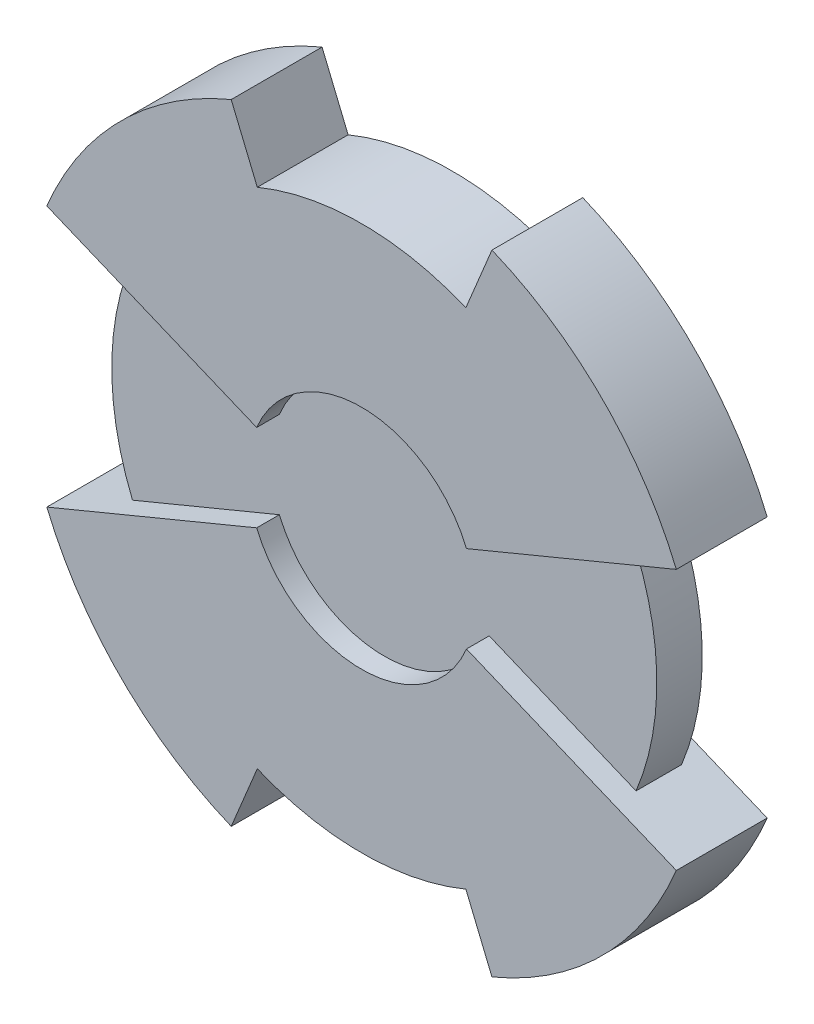
ISO-10303-21;
HEADER;
FILE_DESCRIPTION(('STEP AP214'),'2;1');
FILE_NAME('part.step','',(''),(''),'','','');
FILE_SCHEMA(('AUTOMOTIVE_DESIGN { 1 0 10303 214 1 1 1 1 }'));
ENDSEC;
DATA;
#1=APPLICATION_CONTEXT('core data for automotive mechanical design processes');
#2=APPLICATION_PROTOCOL_DEFINITION('international standard','automotive_design',2000,#1);
#3=PRODUCT_CONTEXT('',#1,'mechanical');
#4=PRODUCT('Part','Part','',(#3));
#5=PRODUCT_RELATED_PRODUCT_CATEGORY('part','',(#4));
#6=PRODUCT_DEFINITION_FORMATION('','',#4);
#7=PRODUCT_DEFINITION_CONTEXT('part definition',#1,'design');
#8=PRODUCT_DEFINITION('design','',#6,#7);
#9=PRODUCT_DEFINITION_SHAPE('','',#8);
#10=(LENGTH_UNIT() NAMED_UNIT(*) SI_UNIT(.MILLI.,.METRE.));
#11=(NAMED_UNIT(*) PLANE_ANGLE_UNIT() SI_UNIT($,.RADIAN.));
#12=(NAMED_UNIT(*) SI_UNIT($,.STERADIAN.) SOLID_ANGLE_UNIT());
#13=UNCERTAINTY_MEASURE_WITH_UNIT(LENGTH_MEASURE(1.E-05),#10,'distance_accuracy_value','');
#14=(GEOMETRIC_REPRESENTATION_CONTEXT(3) GLOBAL_UNCERTAINTY_ASSIGNED_CONTEXT((#13)) GLOBAL_UNIT_ASSIGNED_CONTEXT((#10,
#11,#12)) REPRESENTATION_CONTEXT('',''));
#15=CARTESIAN_POINT('',(0.,0.,0.));
#16=DIRECTION('',(0.,0.,1.));
#17=DIRECTION('',(1.,0.,0.));
#18=AXIS2_PLACEMENT_3D('',#15,#16,#17);
#19=CARTESIAN_POINT('',(0.,0.,10.));
#20=DIRECTION('',(0.,0.,-1.));
#21=DIRECTION('',(-1.,0.,0.));
#22=AXIS2_PLACEMENT_3D('',#19,#20,#21);
#23=CYLINDRICAL_SURFACE('',#22,25.);
#24=DIRECTION('',(0.,0.,-1.));
#25=VECTOR('',#24,1.);
#26=CARTESIAN_POINT('',(23.0969883127822,9.56708580912726,10.));
#27=LINE('',#26,#25);
#28=CARTESIAN_POINT('',(23.0969883127822,9.56708580912726,-5.));
#29=VERTEX_POINT('',#28);
#30=CARTESIAN_POINT('',(23.0969883127822,9.56708580912726,-10.));
#31=VERTEX_POINT('',#30);
#32=EDGE_CURVE('E52',#29,#31,#27,.T.);
#33=ORIENTED_EDGE('',*,*,#32,.F.);
#34=CARTESIAN_POINT('',(0.,0.,-5.));
#35=DIRECTION('',(0.,0.,1.));
#36=DIRECTION('',(1.,0.,0.));
#37=AXIS2_PLACEMENT_3D('',#34,#35,#36);
#38=CIRCLE('',#37,25.);
#39=CARTESIAN_POINT('',(-23.0969883127822,9.56708580912726,-5.));
#40=VERTEX_POINT('',#39);
#41=EDGE_CURVE('E663',#29,#40,#38,.T.);
#42=ORIENTED_EDGE('',*,*,#41,.T.);
#43=DIRECTION('',(0.,0.,-1.));
#44=VECTOR('',#43,1.);
#45=CARTESIAN_POINT('',(-23.0969883127822,9.56708580912726,10.));
#46=LINE('',#45,#44);
#47=CARTESIAN_POINT('',(-23.0969883127822,9.56708580912726,-10.));
#48=VERTEX_POINT('',#47);
#49=EDGE_CURVE('E103',#40,#48,#46,.T.);
#50=ORIENTED_EDGE('',*,*,#49,.T.);
#51=CARTESIAN_POINT('',(0.,0.,-10.));
#52=DIRECTION('',(0.,0.,1.));
#53=DIRECTION('',(1.,0.,0.));
#54=AXIS2_PLACEMENT_3D('',#51,#52,#53);
#55=CIRCLE('',#54,25.);
#56=EDGE_CURVE('E164',#31,#48,#55,.T.);
#57=ORIENTED_EDGE('',*,*,#56,.F.);
#58=EDGE_LOOP('',(#33,#42,#50,#57));
#59=FACE_BOUND('',#58,.T.);
#60=ADVANCED_FACE('F43',(#59),#23,.F.);
#61=CARTESIAN_POINT('',(0.,0.,5.));
#62=DIRECTION('',(0.,0.,1.));
#63=DIRECTION('',(1.,0.,0.));
#64=AXIS2_PLACEMENT_3D('',#61,#62,#63);
#65=CIRCLE('',#64,25.);
#66=CARTESIAN_POINT('',(23.0969883127822,9.56708580912726,5.));
#67=VERTEX_POINT('',#66);
#68=CARTESIAN_POINT('',(-23.0969883127822,9.56708580912726,5.));
#69=VERTEX_POINT('',#68);
#70=EDGE_CURVE('E233',#67,#69,#65,.T.);
#71=ORIENTED_EDGE('',*,*,#70,.F.);
#72=CARTESIAN_POINT('',(23.0969883127822,9.56708580912726,10.));
#73=VERTEX_POINT('',#72);
#74=EDGE_CURVE('E11',#73,#67,#27,.T.);
#75=ORIENTED_EDGE('',*,*,#74,.F.);
#76=CARTESIAN_POINT('',(0.,0.,10.));
#77=DIRECTION('',(0.,0.,1.));
#78=DIRECTION('',(1.,0.,0.));
#79=AXIS2_PLACEMENT_3D('',#76,#77,#78);
#80=CIRCLE('',#79,25.);
#81=CARTESIAN_POINT('',(-23.0969883127822,9.56708580912726,10.));
#82=VERTEX_POINT('',#81);
#83=EDGE_CURVE('E191',#73,#82,#80,.T.);
#84=ORIENTED_EDGE('',*,*,#83,.T.);
#85=EDGE_CURVE('E68',#82,#69,#46,.T.);
#86=ORIENTED_EDGE('',*,*,#85,.T.);
#87=EDGE_LOOP('',(#71,#75,#84,#86));
#88=FACE_BOUND('',#87,.T.);
#89=ADVANCED_FACE('F45',(#88),#23,.F.);
#90=CARTESIAN_POINT('',(0.,0.,10.));
#91=DIRECTION('',(-0.38268343236509,0.923879532511287,0.));
#92=DIRECTION('',(-0.923879532511287,-0.38268343236509,0.));
#93=AXIS2_PLACEMENT_3D('',#90,#91,#92);
#94=PLANE('',#93);
#95=ORIENTED_EDGE('',*,*,#74,.T.);
#96=DIRECTION('',(0.923879532511287,0.38268343236509,0.));
#97=VECTOR('',#96,1.);
#98=CARTESIAN_POINT('',(0.,0.,5.));
#99=LINE('',#98,#97);
#100=CARTESIAN_POINT('',(55.4327719506772,22.9610059419054,5.));
#101=VERTEX_POINT('',#100);
#102=EDGE_CURVE('E242',#67,#101,#99,.T.);
#103=ORIENTED_EDGE('',*,*,#102,.T.);
#104=DIRECTION('',(0.,0.,-1.));
#105=VECTOR('',#104,1.);
#106=CARTESIAN_POINT('',(55.4327719506772,22.9610059419054,5.));
#107=LINE('',#106,#105);
#108=CARTESIAN_POINT('',(55.4327719506772,22.9610059419054,-5.));
#109=VERTEX_POINT('',#108);
#110=EDGE_CURVE('E676',#101,#109,#107,.T.);
#111=ORIENTED_EDGE('',*,*,#110,.T.);
#112=DIRECTION('',(0.923879532511287,0.38268343236509,0.));
#113=VECTOR('',#112,1.);
#114=CARTESIAN_POINT('',(0.,0.,-5.));
#115=LINE('',#114,#113);
#116=EDGE_CURVE('E219',#29,#109,#115,.T.);
#117=ORIENTED_EDGE('',*,*,#116,.F.);
#118=ORIENTED_EDGE('',*,*,#32,.T.);
#119=DIRECTION('',(0.923879532511287,0.38268343236509,0.));
#120=VECTOR('',#119,1.);
#121=CARTESIAN_POINT('',(0.,0.,-10.));
#122=LINE('',#121,#120);
#123=CARTESIAN_POINT('',(69.2909649383465,28.7012574273818,-10.));
#124=VERTEX_POINT('',#123);
#125=EDGE_CURVE('E167',#31,#124,#122,.T.);
#126=ORIENTED_EDGE('',*,*,#125,.T.);
#127=DIRECTION('',(0.,0.,-1.));
#128=VECTOR('',#127,1.);
#129=CARTESIAN_POINT('',(69.2909649383465,28.7012574273818,10.));
#130=LINE('',#129,#128);
#131=CARTESIAN_POINT('',(69.2909649383465,28.7012574273818,10.));
#132=VERTEX_POINT('',#131);
#133=EDGE_CURVE('E203',#132,#124,#130,.T.);
#134=ORIENTED_EDGE('',*,*,#133,.F.);
#135=DIRECTION('',(0.923879532511287,0.38268343236509,0.));
#136=VECTOR('',#135,1.);
#137=CARTESIAN_POINT('',(0.,0.,10.));
#138=LINE('',#137,#136);
#139=EDGE_CURVE('E245',#73,#132,#138,.T.);
#140=ORIENTED_EDGE('',*,*,#139,.F.);
#141=EDGE_LOOP('',(#95,#103,#111,#117,#118,#126,#134,#140));
#142=FACE_BOUND('',#141,.T.);
#143=ADVANCED_FACE('F215',(#142),#94,.F.);
#144=CARTESIAN_POINT('',(0.,0.,10.));
#145=DIRECTION('',(0.,0.,-1.));
#146=DIRECTION('',(-1.,0.,0.));
#147=AXIS2_PLACEMENT_3D('',#144,#145,#146);
#148=CYLINDRICAL_SURFACE('',#147,75.);
#149=CARTESIAN_POINT('',(0.,0.,-10.));
#150=DIRECTION('',(0.,0.,1.));
#151=DIRECTION('',(1.,0.,0.));
#152=AXIS2_PLACEMENT_3D('',#149,#150,#151);
#153=CIRCLE('',#152,75.);
#154=CARTESIAN_POINT('',(28.7012574273813,69.2909649383467,-10.));
#155=VERTEX_POINT('',#154);
#156=EDGE_CURVE('E171',#124,#155,#153,.T.);
#157=ORIENTED_EDGE('',*,*,#156,.T.);
#158=DIRECTION('',(0.,0.,-1.));
#159=VECTOR('',#158,1.);
#160=CARTESIAN_POINT('',(28.7012574273813,69.2909649383467,10.));
#161=LINE('',#160,#159);
#162=CARTESIAN_POINT('',(28.7012574273813,69.2909649383467,10.));
#163=VERTEX_POINT('',#162);
#164=EDGE_CURVE('E201',#163,#155,#161,.T.);
#165=ORIENTED_EDGE('',*,*,#164,.F.);
#166=CARTESIAN_POINT('',(0.,0.,10.));
#167=DIRECTION('',(0.,0.,1.));
#168=DIRECTION('',(1.,0.,0.));
#169=AXIS2_PLACEMENT_3D('',#166,#167,#168);
#170=CIRCLE('',#169,75.);
#171=EDGE_CURVE('E247',#132,#163,#170,.T.);
#172=ORIENTED_EDGE('',*,*,#171,.F.);
#173=ORIENTED_EDGE('',*,*,#133,.T.);
#174=EDGE_LOOP('',(#157,#165,#172,#173));
#175=FACE_BOUND('',#174,.T.);
#176=ADVANCED_FACE('F230',(#175),#148,.T.);
#177=CARTESIAN_POINT('',(0.,0.,10.));
#178=DIRECTION('',(-0.923879532511289,0.382683432365084,0.));
#179=DIRECTION('',(-0.382683432365084,-0.923879532511289,0.));
#180=AXIS2_PLACEMENT_3D('',#177,#178,#179);
#181=PLANE('',#180);
#182=DIRECTION('',(0.382683432365084,0.923879532511289,0.));
#183=VECTOR('',#182,1.);
#184=CARTESIAN_POINT('',(0.,0.,-10.));
#185=LINE('',#184,#183);
#186=CARTESIAN_POINT('',(22.9610059419051,55.4327719506773,-10.));
#187=VERTEX_POINT('',#186);
#188=EDGE_CURVE('E175',#187,#155,#185,.T.);
#189=ORIENTED_EDGE('',*,*,#188,.F.);
#190=DIRECTION('',(0.,0.,-1.));
#191=VECTOR('',#190,1.);
#192=CARTESIAN_POINT('',(22.9610059419051,55.4327719506773,10.));
#193=LINE('',#192,#191);
#194=CARTESIAN_POINT('',(22.9610059419051,55.4327719506773,10.));
#195=VERTEX_POINT('',#194);
#196=EDGE_CURVE('E198',#195,#187,#193,.T.);
#197=ORIENTED_EDGE('',*,*,#196,.F.);
#198=DIRECTION('',(0.382683432365084,0.923879532511289,0.));
#199=VECTOR('',#198,1.);
#200=CARTESIAN_POINT('',(0.,0.,10.));
#201=LINE('',#200,#199);
#202=EDGE_CURVE('E256',#195,#163,#201,.T.);
#203=ORIENTED_EDGE('',*,*,#202,.T.);
#204=ORIENTED_EDGE('',*,*,#164,.T.);
#205=EDGE_LOOP('',(#189,#197,#203,#204));
#206=FACE_BOUND('',#205,.T.);
#207=ADVANCED_FACE('F262',(#206),#181,.T.);
#208=CARTESIAN_POINT('',(0.,0.,10.));
#209=DIRECTION('',(0.,0.,-1.));
#210=DIRECTION('',(-1.,0.,0.));
#211=AXIS2_PLACEMENT_3D('',#208,#209,#210);
#212=CYLINDRICAL_SURFACE('',#211,60.);
#213=CARTESIAN_POINT('',(0.,0.,-10.));
#214=DIRECTION('',(0.,0.,1.));
#215=DIRECTION('',(1.,0.,0.));
#216=AXIS2_PLACEMENT_3D('',#213,#214,#215);
#217=CIRCLE('',#216,60.);
#218=CARTESIAN_POINT('',(-22.9610059419051,55.4327719506773,-10.));
#219=VERTEX_POINT('',#218);
#220=EDGE_CURVE('E179',#187,#219,#217,.T.);
#221=ORIENTED_EDGE('',*,*,#220,.T.);
#222=DIRECTION('',(0.,0.,-1.));
#223=VECTOR('',#222,1.);
#224=CARTESIAN_POINT('',(-22.9610059419051,55.4327719506773,10.));
#225=LINE('',#224,#223);
#226=CARTESIAN_POINT('',(-22.9610059419051,55.4327719506773,10.));
#227=VERTEX_POINT('',#226);
#228=EDGE_CURVE('E153',#227,#219,#225,.T.);
#229=ORIENTED_EDGE('',*,*,#228,.F.);
#230=CARTESIAN_POINT('',(0.,0.,10.));
#231=DIRECTION('',(0.,0.,1.));
#232=DIRECTION('',(1.,0.,0.));
#233=AXIS2_PLACEMENT_3D('',#230,#231,#232);
#234=CIRCLE('',#233,60.);
#235=EDGE_CURVE('E138',#195,#227,#234,.T.);
#236=ORIENTED_EDGE('',*,*,#235,.F.);
#237=ORIENTED_EDGE('',*,*,#196,.T.);
#238=EDGE_LOOP('',(#221,#229,#236,#237));
#239=FACE_BOUND('',#238,.T.);
#240=ADVANCED_FACE('F266',(#239),#212,.T.);
#241=CARTESIAN_POINT('',(0.,0.,10.));
#242=DIRECTION('',(-0.923879532511289,-0.382683432365084,0.));
#243=DIRECTION('',(0.382683432365084,-0.923879532511289,0.));
#244=AXIS2_PLACEMENT_3D('',#241,#242,#243);
#245=PLANE('',#244);
#246=DIRECTION('',(-0.382683432365084,0.923879532511289,0.));
#247=VECTOR('',#246,1.);
#248=CARTESIAN_POINT('',(0.,0.,-10.));
#249=LINE('',#248,#247);
#250=CARTESIAN_POINT('',(-28.7012574273813,69.2909649383467,-10.));
#251=VERTEX_POINT('',#250);
#252=EDGE_CURVE('E148',#219,#251,#249,.T.);
#253=ORIENTED_EDGE('',*,*,#252,.T.);
#254=DIRECTION('',(0.,0.,-1.));
#255=VECTOR('',#254,1.);
#256=CARTESIAN_POINT('',(-28.7012574273813,69.2909649383467,10.));
#257=LINE('',#256,#255);
#258=CARTESIAN_POINT('',(-28.7012574273813,69.2909649383467,10.));
#259=VERTEX_POINT('',#258);
#260=EDGE_CURVE('E145',#259,#251,#257,.T.);
#261=ORIENTED_EDGE('',*,*,#260,.F.);
#262=DIRECTION('',(-0.382683432365084,0.923879532511289,0.));
#263=VECTOR('',#262,1.);
#264=CARTESIAN_POINT('',(0.,0.,10.));
#265=LINE('',#264,#263);
#266=EDGE_CURVE('E128',#227,#259,#265,.T.);
#267=ORIENTED_EDGE('',*,*,#266,.F.);
#268=ORIENTED_EDGE('',*,*,#228,.T.);
#269=EDGE_LOOP('',(#253,#261,#267,#268));
#270=FACE_BOUND('',#269,.T.);
#271=ADVANCED_FACE('F146',(#270),#245,.F.);
#272=CARTESIAN_POINT('',(0.,0.,10.));
#273=DIRECTION('',(0.,0.,-1.));
#274=DIRECTION('',(-1.,0.,0.));
#275=AXIS2_PLACEMENT_3D('',#272,#273,#274);
#276=CYLINDRICAL_SURFACE('',#275,75.);
#277=CARTESIAN_POINT('',(0.,0.,-10.));
#278=DIRECTION('',(0.,0.,1.));
#279=DIRECTION('',(1.,0.,0.));
#280=AXIS2_PLACEMENT_3D('',#277,#278,#279);
#281=CIRCLE('',#280,75.);
#282=CARTESIAN_POINT('',(-69.2909649383465,28.7012574273818,-10.));
#283=VERTEX_POINT('',#282);
#284=EDGE_CURVE('E184',#251,#283,#281,.T.);
#285=ORIENTED_EDGE('',*,*,#284,.T.);
#286=DIRECTION('',(0.,0.,-1.));
#287=VECTOR('',#286,1.);
#288=CARTESIAN_POINT('',(-69.2909649383465,28.7012574273818,10.));
#289=LINE('',#288,#287);
#290=CARTESIAN_POINT('',(-69.2909649383465,28.7012574273818,10.));
#291=VERTEX_POINT('',#290);
#292=EDGE_CURVE('E154',#291,#283,#289,.T.);
#293=ORIENTED_EDGE('',*,*,#292,.F.);
#294=CARTESIAN_POINT('',(0.,0.,10.));
#295=DIRECTION('',(0.,0.,1.));
#296=DIRECTION('',(1.,0.,0.));
#297=AXIS2_PLACEMENT_3D('',#294,#295,#296);
#298=CIRCLE('',#297,75.);
#299=EDGE_CURVE('E134',#259,#291,#298,.T.);
#300=ORIENTED_EDGE('',*,*,#299,.F.);
#301=ORIENTED_EDGE('',*,*,#260,.T.);
#302=EDGE_LOOP('',(#285,#293,#300,#301));
#303=FACE_BOUND('',#302,.T.);
#304=ADVANCED_FACE('F156',(#303),#276,.T.);
#305=CARTESIAN_POINT('',(0.,0.,10.));
#306=DIRECTION('',(-0.38268343236509,-0.923879532511287,0.));
#307=DIRECTION('',(0.923879532511287,-0.38268343236509,0.));
#308=AXIS2_PLACEMENT_3D('',#305,#306,#307);
#309=PLANE('',#308);
#310=DIRECTION('',(-0.923879532511287,0.38268343236509,0.));
#311=VECTOR('',#310,1.);
#312=CARTESIAN_POINT('',(0.,0.,5.));
#313=LINE('',#312,#311);
#314=CARTESIAN_POINT('',(-55.4327719506772,22.9610059419054,5.));
#315=VERTEX_POINT('',#314);
#316=EDGE_CURVE('E241',#69,#315,#313,.T.);
#317=ORIENTED_EDGE('',*,*,#316,.F.);
#318=ORIENTED_EDGE('',*,*,#85,.F.);
#319=DIRECTION('',(-0.923879532511287,0.38268343236509,0.));
#320=VECTOR('',#319,1.);
#321=CARTESIAN_POINT('',(0.,0.,10.));
#322=LINE('',#321,#320);
#323=EDGE_CURVE('E158',#82,#291,#322,.T.);
#324=ORIENTED_EDGE('',*,*,#323,.T.);
#325=ORIENTED_EDGE('',*,*,#292,.T.);
#326=DIRECTION('',(-0.923879532511287,0.38268343236509,0.));
#327=VECTOR('',#326,1.);
#328=CARTESIAN_POINT('',(0.,0.,-10.));
#329=LINE('',#328,#327);
#330=EDGE_CURVE('E187',#48,#283,#329,.T.);
#331=ORIENTED_EDGE('',*,*,#330,.F.);
#332=ORIENTED_EDGE('',*,*,#49,.F.);
#333=DIRECTION('',(-0.923879532511287,0.38268343236509,0.));
#334=VECTOR('',#333,1.);
#335=CARTESIAN_POINT('',(0.,0.,-5.));
#336=LINE('',#335,#334);
#337=CARTESIAN_POINT('',(-55.4327719506772,22.9610059419054,-5.));
#338=VERTEX_POINT('',#337);
#339=EDGE_CURVE('E666',#40,#338,#336,.T.);
#340=ORIENTED_EDGE('',*,*,#339,.T.);
#341=DIRECTION('',(0.,0.,-1.));
#342=VECTOR('',#341,1.);
#343=CARTESIAN_POINT('',(-55.4327719506772,22.9610059419054,5.));
#344=LINE('',#343,#342);
#345=EDGE_CURVE('E674',#315,#338,#344,.T.);
#346=ORIENTED_EDGE('',*,*,#345,.F.);
#347=EDGE_LOOP('',(#317,#318,#324,#325,#331,#332,#340,#346));
#348=FACE_BOUND('',#347,.T.);
#349=ADVANCED_FACE('F308',(#348),#309,.T.);
#350=CARTESIAN_POINT('',(0.,0.,10.));
#351=DIRECTION('',(0.,0.,1.));
#352=DIRECTION('',(1.,0.,0.));
#353=AXIS2_PLACEMENT_3D('',#350,#351,#352);
#354=PLANE('',#353);
#355=ORIENTED_EDGE('',*,*,#83,.F.);
#356=ORIENTED_EDGE('',*,*,#139,.T.);
#357=ORIENTED_EDGE('',*,*,#171,.T.);
#358=ORIENTED_EDGE('',*,*,#202,.F.);
#359=ORIENTED_EDGE('',*,*,#235,.T.);
#360=ORIENTED_EDGE('',*,*,#266,.T.);
#361=ORIENTED_EDGE('',*,*,#299,.T.);
#362=ORIENTED_EDGE('',*,*,#323,.F.);
#363=EDGE_LOOP('',(#355,#356,#357,#358,#359,#360,#361,#362));
#364=FACE_BOUND('',#363,.T.);
#365=ADVANCED_FACE('F131',(#364),#354,.T.);
#366=CARTESIAN_POINT('',(0.,0.,-10.));
#367=DIRECTION('',(0.,0.,1.));
#368=DIRECTION('',(1.,0.,0.));
#369=AXIS2_PLACEMENT_3D('',#366,#367,#368);
#370=PLANE('',#369);
#371=ORIENTED_EDGE('',*,*,#56,.T.);
#372=ORIENTED_EDGE('',*,*,#330,.T.);
#373=ORIENTED_EDGE('',*,*,#284,.F.);
#374=ORIENTED_EDGE('',*,*,#252,.F.);
#375=ORIENTED_EDGE('',*,*,#220,.F.);
#376=ORIENTED_EDGE('',*,*,#188,.T.);
#377=ORIENTED_EDGE('',*,*,#156,.F.);
#378=ORIENTED_EDGE('',*,*,#125,.F.);
#379=EDGE_LOOP('',(#371,#372,#373,#374,#375,#376,#377,#378));
#380=FACE_BOUND('',#379,.T.);
#381=ADVANCED_FACE('F221',(#380),#370,.F.);
#382=CARTESIAN_POINT('',(0.,0.,5.));
#383=DIRECTION('',(0.,0.,-1.));
#384=DIRECTION('',(-1.,0.,0.));
#385=AXIS2_PLACEMENT_3D('',#382,#383,#384);
#386=CYLINDRICAL_SURFACE('',#385,60.);
#387=CARTESIAN_POINT('',(0.,0.,-5.));
#388=DIRECTION('',(0.,0.,1.));
#389=DIRECTION('',(1.,0.,0.));
#390=AXIS2_PLACEMENT_3D('',#387,#388,#389);
#391=CIRCLE('',#390,60.);
#392=CARTESIAN_POINT('',(55.4327719506772,-22.9610059419054,-5.));
#393=VERTEX_POINT('',#392);
#394=EDGE_CURVE('E657',#393,#109,#391,.T.);
#395=ORIENTED_EDGE('',*,*,#394,.T.);
#396=ORIENTED_EDGE('',*,*,#110,.F.);
#397=CARTESIAN_POINT('',(0.,0.,5.));
#398=DIRECTION('',(0.,0.,1.));
#399=DIRECTION('',(1.,0.,0.));
#400=AXIS2_PLACEMENT_3D('',#397,#398,#399);
#401=CIRCLE('',#400,60.);
#402=CARTESIAN_POINT('',(55.4327719506772,-22.9610059419054,5.));
#403=VERTEX_POINT('',#402);
#404=EDGE_CURVE('E638',#403,#101,#401,.T.);
#405=ORIENTED_EDGE('',*,*,#404,.F.);
#406=DIRECTION('',(0.,0.,-1.));
#407=VECTOR('',#406,1.);
#408=CARTESIAN_POINT('',(55.4327719506772,-22.9610059419054,5.));
#409=LINE('',#408,#407);
#410=EDGE_CURVE('E168',#403,#393,#409,.T.);
#411=ORIENTED_EDGE('',*,*,#410,.T.);
#412=EDGE_LOOP('',(#395,#396,#405,#411));
#413=FACE_BOUND('',#412,.T.);
#414=ADVANCED_FACE('F328',(#413),#386,.T.);
#415=CARTESIAN_POINT('',(-55.4327719506772,-22.9610059419054,-5.));
#416=VERTEX_POINT('',#415);
#417=EDGE_CURVE('E59',#338,#416,#391,.T.);
#418=ORIENTED_EDGE('',*,*,#417,.T.);
#419=DIRECTION('',(0.,0.,-1.));
#420=VECTOR('',#419,1.);
#421=CARTESIAN_POINT('',(-55.4327719506772,-22.9610059419054,5.));
#422=LINE('',#421,#420);
#423=CARTESIAN_POINT('',(-55.4327719506772,-22.9610059419054,5.));
#424=VERTEX_POINT('',#423);
#425=EDGE_CURVE('E670',#424,#416,#422,.T.);
#426=ORIENTED_EDGE('',*,*,#425,.F.);
#427=EDGE_CURVE('E642',#315,#424,#401,.T.);
#428=ORIENTED_EDGE('',*,*,#427,.F.);
#429=ORIENTED_EDGE('',*,*,#345,.T.);
#430=EDGE_LOOP('',(#418,#426,#428,#429));
#431=FACE_BOUND('',#430,.T.);
#432=ADVANCED_FACE('F363',(#431),#386,.T.);
#433=CARTESIAN_POINT('',(0.,0.,5.));
#434=DIRECTION('',(0.,0.,1.));
#435=DIRECTION('',(1.,0.,0.));
#436=AXIS2_PLACEMENT_3D('',#433,#434,#435);
#437=PLANE('',#436);
#438=DIRECTION('',(-0.923879532511286,-0.382683432365091,0.));
#439=VECTOR('',#438,1.);
#440=CARTESIAN_POINT('',(0.,0.,5.));
#441=LINE('',#440,#439);
#442=CARTESIAN_POINT('',(-23.0969883127822,-9.56708580912727,5.));
#443=VERTEX_POINT('',#442);
#444=EDGE_CURVE('E626',#443,#424,#441,.T.);
#445=ORIENTED_EDGE('',*,*,#444,.F.);
#446=CARTESIAN_POINT('',(0.,0.,5.));
#447=DIRECTION('',(0.,0.,1.));
#448=DIRECTION('',(1.,0.,0.));
#449=AXIS2_PLACEMENT_3D('',#446,#447,#448);
#450=CIRCLE('',#449,25.);
#451=CARTESIAN_POINT('',(23.0969883127822,-9.56708580912727,5.));
#452=VERTEX_POINT('',#451);
#453=EDGE_CURVE('E630',#443,#452,#450,.T.);
#454=ORIENTED_EDGE('',*,*,#453,.T.);
#455=DIRECTION('',(0.923879532511286,-0.382683432365091,0.));
#456=VECTOR('',#455,1.);
#457=CARTESIAN_POINT('',(0.,0.,5.));
#458=LINE('',#457,#456);
#459=EDGE_CURVE('E634',#452,#403,#458,.T.);
#460=ORIENTED_EDGE('',*,*,#459,.T.);
#461=ORIENTED_EDGE('',*,*,#404,.T.);
#462=ORIENTED_EDGE('',*,*,#102,.F.);
#463=ORIENTED_EDGE('',*,*,#70,.T.);
#464=ORIENTED_EDGE('',*,*,#316,.T.);
#465=ORIENTED_EDGE('',*,*,#427,.T.);
#466=EDGE_LOOP('',(#445,#454,#460,#461,#462,#463,#464,#465));
#467=FACE_BOUND('',#466,.T.);
#468=ADVANCED_FACE('F375',(#467),#437,.T.);
#469=CARTESIAN_POINT('',(0.,0.,-5.));
#470=DIRECTION('',(0.,0.,1.));
#471=DIRECTION('',(1.,0.,0.));
#472=AXIS2_PLACEMENT_3D('',#469,#470,#471);
#473=PLANE('',#472);
#474=DIRECTION('',(-0.923879532511286,-0.382683432365091,0.));
#475=VECTOR('',#474,1.);
#476=CARTESIAN_POINT('',(0.,0.,-5.));
#477=LINE('',#476,#475);
#478=CARTESIAN_POINT('',(-23.0969883127822,-9.56708580912727,-5.));
#479=VERTEX_POINT('',#478);
#480=EDGE_CURVE('E625',#479,#416,#477,.T.);
#481=ORIENTED_EDGE('',*,*,#480,.T.);
#482=ORIENTED_EDGE('',*,*,#417,.F.);
#483=ORIENTED_EDGE('',*,*,#339,.F.);
#484=ORIENTED_EDGE('',*,*,#41,.F.);
#485=ORIENTED_EDGE('',*,*,#116,.T.);
#486=ORIENTED_EDGE('',*,*,#394,.F.);
#487=DIRECTION('',(0.923879532511286,-0.382683432365091,0.));
#488=VECTOR('',#487,1.);
#489=CARTESIAN_POINT('',(0.,0.,-5.));
#490=LINE('',#489,#488);
#491=CARTESIAN_POINT('',(23.0969883127822,-9.56708580912727,-5.));
#492=VERTEX_POINT('',#491);
#493=EDGE_CURVE('E653',#492,#393,#490,.T.);
#494=ORIENTED_EDGE('',*,*,#493,.F.);
#495=CARTESIAN_POINT('',(0.,0.,-5.));
#496=DIRECTION('',(0.,0.,1.));
#497=DIRECTION('',(1.,0.,0.));
#498=AXIS2_PLACEMENT_3D('',#495,#496,#497);
#499=CIRCLE('',#498,25.);
#500=EDGE_CURVE('E649',#479,#492,#499,.T.);
#501=ORIENTED_EDGE('',*,*,#500,.F.);
#502=EDGE_LOOP('',(#481,#482,#483,#484,#485,#486,#494,#501));
#503=FACE_BOUND('',#502,.T.);
#504=ADVANCED_FACE('F385',(#503),#473,.F.);
#505=CARTESIAN_POINT('',(0.,0.,10.));
#506=DIRECTION('',(0.,0.,-1.));
#507=DIRECTION('',(-1.,0.,0.));
#508=AXIS2_PLACEMENT_3D('',#505,#506,#507);
#509=CYLINDRICAL_SURFACE('',#508,25.);
#510=ORIENTED_EDGE('',*,*,#500,.T.);
#511=DIRECTION('',(0.,0.,-1.));
#512=VECTOR('',#511,1.);
#513=CARTESIAN_POINT('',(23.0969883127822,-9.56708580912727,10.));
#514=LINE('',#513,#512);
#515=CARTESIAN_POINT('',(23.0969883127822,-9.56708580912727,-10.));
#516=VERTEX_POINT('',#515);
#517=EDGE_CURVE('E604',#492,#516,#514,.T.);
#518=ORIENTED_EDGE('',*,*,#517,.T.);
#519=CARTESIAN_POINT('',(0.,0.,-10.));
#520=DIRECTION('',(0.,0.,1.));
#521=DIRECTION('',(1.,0.,0.));
#522=AXIS2_PLACEMENT_3D('',#519,#520,#521);
#523=CIRCLE('',#522,25.);
#524=CARTESIAN_POINT('',(-23.0969883127822,-9.56708580912727,-10.));
#525=VERTEX_POINT('',#524);
#526=EDGE_CURVE('E581',#525,#516,#523,.T.);
#527=ORIENTED_EDGE('',*,*,#526,.F.);
#528=DIRECTION('',(0.,0.,-1.));
#529=VECTOR('',#528,1.);
#530=CARTESIAN_POINT('',(-23.0969883127822,-9.56708580912727,10.));
#531=LINE('',#530,#529);
#532=EDGE_CURVE('E599',#479,#525,#531,.T.);
#533=ORIENTED_EDGE('',*,*,#532,.F.);
#534=EDGE_LOOP('',(#510,#518,#527,#533));
#535=FACE_BOUND('',#534,.T.);
#536=ADVANCED_FACE('F395',(#535),#509,.F.);
#537=CARTESIAN_POINT('',(0.,0.,10.));
#538=DIRECTION('',(0.923879532511289,-0.382683432365084,0.));
#539=DIRECTION('',(0.382683432365084,0.923879532511289,0.));
#540=AXIS2_PLACEMENT_3D('',#537,#538,#539);
#541=PLANE('',#540);
#542=DIRECTION('',(-0.382683432365084,-0.923879532511289,0.));
#543=VECTOR('',#542,1.);
#544=CARTESIAN_POINT('',(0.,0.,-10.));
#545=LINE('',#544,#543);
#546=CARTESIAN_POINT('',(-22.9610059419051,-55.4327719506773,-10.));
#547=VERTEX_POINT('',#546);
#548=CARTESIAN_POINT('',(-28.7012574273813,-69.2909649383467,-10.));
#549=VERTEX_POINT('',#548);
#550=EDGE_CURVE('E548',#547,#549,#545,.T.);
#551=ORIENTED_EDGE('',*,*,#550,.F.);
#552=DIRECTION('',(0.,0.,-1.));
#553=VECTOR('',#552,1.);
#554=CARTESIAN_POINT('',(-22.9610059419051,-55.4327719506773,10.));
#555=LINE('',#554,#553);
#556=CARTESIAN_POINT('',(-22.9610059419051,-55.4327719506773,10.));
#557=VERTEX_POINT('',#556);
#558=EDGE_CURVE('E621',#557,#547,#555,.T.);
#559=ORIENTED_EDGE('',*,*,#558,.F.);
#560=DIRECTION('',(-0.382683432365084,-0.923879532511289,0.));
#561=VECTOR('',#560,1.);
#562=CARTESIAN_POINT('',(0.,0.,10.));
#563=LINE('',#562,#561);
#564=CARTESIAN_POINT('',(-28.7012574273813,-69.2909649383467,10.));
#565=VERTEX_POINT('',#564);
#566=EDGE_CURVE('E591',#557,#565,#563,.T.);
#567=ORIENTED_EDGE('',*,*,#566,.T.);
#568=DIRECTION('',(0.,0.,-1.));
#569=VECTOR('',#568,1.);
#570=CARTESIAN_POINT('',(-28.7012574273813,-69.2909649383467,10.));
#571=LINE('',#570,#569);
#572=EDGE_CURVE('E592',#565,#549,#571,.T.);
#573=ORIENTED_EDGE('',*,*,#572,.T.);
#574=EDGE_LOOP('',(#551,#559,#567,#573));
#575=FACE_BOUND('',#574,.T.);
#576=ADVANCED_FACE('F405',(#575),#541,.T.);
#577=CARTESIAN_POINT('',(0.,0.,10.));
#578=DIRECTION('',(0.,0.,-1.));
#579=DIRECTION('',(-1.,0.,0.));
#580=AXIS2_PLACEMENT_3D('',#577,#578,#579);
#581=CYLINDRICAL_SURFACE('',#580,60.);
#582=CARTESIAN_POINT('',(0.,0.,-10.));
#583=DIRECTION('',(0.,0.,1.));
#584=DIRECTION('',(1.,0.,0.));
#585=AXIS2_PLACEMENT_3D('',#582,#583,#584);
#586=CIRCLE('',#585,60.);
#587=CARTESIAN_POINT('',(22.9610059419051,-55.4327719506773,-10.));
#588=VERTEX_POINT('',#587);
#589=EDGE_CURVE('E556',#547,#588,#586,.T.);
#590=ORIENTED_EDGE('',*,*,#589,.T.);
#591=DIRECTION('',(0.,0.,-1.));
#592=VECTOR('',#591,1.);
#593=CARTESIAN_POINT('',(22.9610059419051,-55.4327719506773,10.));
#594=LINE('',#593,#592);
#595=CARTESIAN_POINT('',(22.9610059419051,-55.4327719506773,10.));
#596=VERTEX_POINT('',#595);
#597=EDGE_CURVE('E617',#596,#588,#594,.T.);
#598=ORIENTED_EDGE('',*,*,#597,.F.);
#599=CARTESIAN_POINT('',(0.,0.,10.));
#600=DIRECTION('',(0.,0.,1.));
#601=DIRECTION('',(1.,0.,0.));
#602=AXIS2_PLACEMENT_3D('',#599,#600,#601);
#603=CIRCLE('',#602,60.);
#604=EDGE_CURVE('E735',#557,#596,#603,.T.);
#605=ORIENTED_EDGE('',*,*,#604,.F.);
#606=ORIENTED_EDGE('',*,*,#558,.T.);
#607=EDGE_LOOP('',(#590,#598,#605,#606));
#608=FACE_BOUND('',#607,.T.);
#609=ADVANCED_FACE('F417',(#608),#581,.T.);
#610=CARTESIAN_POINT('',(0.,0.,10.));
#611=DIRECTION('',(0.923879532511289,0.382683432365084,0.));
#612=DIRECTION('',(-0.382683432365084,0.923879532511289,0.));
#613=AXIS2_PLACEMENT_3D('',#610,#611,#612);
#614=PLANE('',#613);
#615=DIRECTION('',(0.382683432365084,-0.923879532511289,0.));
#616=VECTOR('',#615,1.);
#617=CARTESIAN_POINT('',(0.,0.,-10.));
#618=LINE('',#617,#616);
#619=CARTESIAN_POINT('',(28.7012574273813,-69.2909649383467,-10.));
#620=VERTEX_POINT('',#619);
#621=EDGE_CURVE('E564',#588,#620,#618,.T.);
#622=ORIENTED_EDGE('',*,*,#621,.T.);
#623=DIRECTION('',(0.,0.,-1.));
#624=VECTOR('',#623,1.);
#625=CARTESIAN_POINT('',(28.7012574273813,-69.2909649383467,10.));
#626=LINE('',#625,#624);
#627=CARTESIAN_POINT('',(28.7012574273813,-69.2909649383467,10.));
#628=VERTEX_POINT('',#627);
#629=EDGE_CURVE('E613',#628,#620,#626,.T.);
#630=ORIENTED_EDGE('',*,*,#629,.F.);
#631=DIRECTION('',(0.382683432365084,-0.923879532511289,0.));
#632=VECTOR('',#631,1.);
#633=CARTESIAN_POINT('',(0.,0.,10.));
#634=LINE('',#633,#632);
#635=EDGE_CURVE('E731',#596,#628,#634,.T.);
#636=ORIENTED_EDGE('',*,*,#635,.F.);
#637=ORIENTED_EDGE('',*,*,#597,.T.);
#638=EDGE_LOOP('',(#622,#630,#636,#637));
#639=FACE_BOUND('',#638,.T.);
#640=ADVANCED_FACE('F426',(#639),#614,.F.);
#641=CARTESIAN_POINT('',(0.,0.,10.));
#642=DIRECTION('',(0.,0.,-1.));
#643=DIRECTION('',(-1.,0.,0.));
#644=AXIS2_PLACEMENT_3D('',#641,#642,#643);
#645=CYLINDRICAL_SURFACE('',#644,75.);
#646=CARTESIAN_POINT('',(0.,0.,-10.));
#647=DIRECTION('',(0.,0.,1.));
#648=DIRECTION('',(1.,0.,0.));
#649=AXIS2_PLACEMENT_3D('',#646,#647,#648);
#650=CIRCLE('',#649,75.);
#651=CARTESIAN_POINT('',(69.2909649383465,-28.7012574273818,-10.));
#652=VERTEX_POINT('',#651);
#653=EDGE_CURVE('E573',#620,#652,#650,.T.);
#654=ORIENTED_EDGE('',*,*,#653,.T.);
#655=DIRECTION('',(0.,0.,-1.));
#656=VECTOR('',#655,1.);
#657=CARTESIAN_POINT('',(69.2909649383465,-28.7012574273818,10.));
#658=LINE('',#657,#656);
#659=CARTESIAN_POINT('',(69.2909649383465,-28.7012574273818,10.));
#660=VERTEX_POINT('',#659);
#661=EDGE_CURVE('E609',#660,#652,#658,.T.);
#662=ORIENTED_EDGE('',*,*,#661,.F.);
#663=CARTESIAN_POINT('',(0.,0.,10.));
#664=DIRECTION('',(0.,0.,1.));
#665=DIRECTION('',(1.,0.,0.));
#666=AXIS2_PLACEMENT_3D('',#663,#664,#665);
#667=CIRCLE('',#666,75.);
#668=EDGE_CURVE('E727',#628,#660,#667,.T.);
#669=ORIENTED_EDGE('',*,*,#668,.F.);
#670=ORIENTED_EDGE('',*,*,#629,.T.);
#671=EDGE_LOOP('',(#654,#662,#669,#670));
#672=FACE_BOUND('',#671,.T.);
#673=ADVANCED_FACE('F436',(#672),#645,.T.);
#674=CARTESIAN_POINT('',(0.,0.,10.));
#675=DIRECTION('',(0.382683432365091,0.923879532511287,0.));
#676=DIRECTION('',(-0.923879532511287,0.382683432365091,0.));
#677=AXIS2_PLACEMENT_3D('',#674,#675,#676);
#678=PLANE('',#677);
#679=ORIENTED_EDGE('',*,*,#410,.F.);
#680=ORIENTED_EDGE('',*,*,#459,.F.);
#681=CARTESIAN_POINT('',(23.0969883127822,-9.56708580912727,10.));
#682=VERTEX_POINT('',#681);
#683=EDGE_CURVE('E605',#682,#452,#514,.T.);
#684=ORIENTED_EDGE('',*,*,#683,.F.);
#685=DIRECTION('',(0.923879532511286,-0.382683432365091,0.));
#686=VECTOR('',#685,1.);
#687=CARTESIAN_POINT('',(0.,0.,10.));
#688=LINE('',#687,#686);
#689=EDGE_CURVE('E723',#682,#660,#688,.T.);
#690=ORIENTED_EDGE('',*,*,#689,.T.);
#691=ORIENTED_EDGE('',*,*,#661,.T.);
#692=DIRECTION('',(0.923879532511286,-0.382683432365091,0.));
#693=VECTOR('',#692,1.);
#694=CARTESIAN_POINT('',(0.,0.,-10.));
#695=LINE('',#694,#693);
#696=EDGE_CURVE('E577',#516,#652,#695,.T.);
#697=ORIENTED_EDGE('',*,*,#696,.F.);
#698=ORIENTED_EDGE('',*,*,#517,.F.);
#699=ORIENTED_EDGE('',*,*,#493,.T.);
#700=EDGE_LOOP('',(#679,#680,#684,#690,#691,#697,#698,#699));
#701=FACE_BOUND('',#700,.T.);
#702=ADVANCED_FACE('F446',(#701),#678,.T.);
#703=ORIENTED_EDGE('',*,*,#683,.T.);
#704=ORIENTED_EDGE('',*,*,#453,.F.);
#705=CARTESIAN_POINT('',(-23.0969883127822,-9.56708580912727,10.));
#706=VERTEX_POINT('',#705);
#707=EDGE_CURVE('E600',#706,#443,#531,.T.);
#708=ORIENTED_EDGE('',*,*,#707,.F.);
#709=CARTESIAN_POINT('',(0.,0.,10.));
#710=DIRECTION('',(0.,0.,1.));
#711=DIRECTION('',(1.,0.,0.));
#712=AXIS2_PLACEMENT_3D('',#709,#710,#711);
#713=CIRCLE('',#712,25.);
#714=EDGE_CURVE('E720',#706,#682,#713,.T.);
#715=ORIENTED_EDGE('',*,*,#714,.T.);
#716=EDGE_LOOP('',(#703,#704,#708,#715));
#717=FACE_BOUND('',#716,.T.);
#718=ADVANCED_FACE('F408',(#717),#509,.F.);
#719=CARTESIAN_POINT('',(0.,0.,10.));
#720=DIRECTION('',(0.382683432365091,-0.923879532511287,0.));
#721=DIRECTION('',(0.923879532511287,0.382683432365091,0.));
#722=AXIS2_PLACEMENT_3D('',#719,#720,#721);
#723=PLANE('',#722);
#724=ORIENTED_EDGE('',*,*,#444,.T.);
#725=ORIENTED_EDGE('',*,*,#425,.T.);
#726=ORIENTED_EDGE('',*,*,#480,.F.);
#727=ORIENTED_EDGE('',*,*,#532,.T.);
#728=DIRECTION('',(-0.923879532511286,-0.382683432365091,0.));
#729=VECTOR('',#728,1.);
#730=CARTESIAN_POINT('',(0.,0.,-10.));
#731=LINE('',#730,#729);
#732=CARTESIAN_POINT('',(-69.2909649383465,-28.7012574273818,-10.));
#733=VERTEX_POINT('',#732);
#734=EDGE_CURVE('E585',#525,#733,#731,.T.);
#735=ORIENTED_EDGE('',*,*,#734,.T.);
#736=DIRECTION('',(0.,0.,-1.));
#737=VECTOR('',#736,1.);
#738=CARTESIAN_POINT('',(-69.2909649383465,-28.7012574273818,10.));
#739=LINE('',#738,#737);
#740=CARTESIAN_POINT('',(-69.2909649383465,-28.7012574273818,10.));
#741=VERTEX_POINT('',#740);
#742=EDGE_CURVE('E595',#741,#733,#739,.T.);
#743=ORIENTED_EDGE('',*,*,#742,.F.);
#744=DIRECTION('',(-0.923879532511286,-0.382683432365091,0.));
#745=VECTOR('',#744,1.);
#746=CARTESIAN_POINT('',(0.,0.,10.));
#747=LINE('',#746,#745);
#748=EDGE_CURVE('E717',#706,#741,#747,.T.);
#749=ORIENTED_EDGE('',*,*,#748,.F.);
#750=ORIENTED_EDGE('',*,*,#707,.T.);
#751=EDGE_LOOP('',(#724,#725,#726,#727,#735,#743,#749,#750));
#752=FACE_BOUND('',#751,.T.);
#753=ADVANCED_FACE('F465',(#752),#723,.F.);
#754=CARTESIAN_POINT('',(0.,0.,10.));
#755=DIRECTION('',(0.,0.,-1.));
#756=DIRECTION('',(-1.,0.,0.));
#757=AXIS2_PLACEMENT_3D('',#754,#755,#756);
#758=CYLINDRICAL_SURFACE('',#757,75.);
#759=CARTESIAN_POINT('',(0.,0.,-10.));
#760=DIRECTION('',(0.,0.,1.));
#761=DIRECTION('',(1.,0.,0.));
#762=AXIS2_PLACEMENT_3D('',#759,#760,#761);
#763=CIRCLE('',#762,75.);
#764=EDGE_CURVE('E552',#733,#549,#763,.T.);
#765=ORIENTED_EDGE('',*,*,#764,.T.);
#766=ORIENTED_EDGE('',*,*,#572,.F.);
#767=CARTESIAN_POINT('',(0.,0.,10.));
#768=DIRECTION('',(0.,0.,1.));
#769=DIRECTION('',(1.,0.,0.));
#770=AXIS2_PLACEMENT_3D('',#767,#768,#769);
#771=CIRCLE('',#770,75.);
#772=EDGE_CURVE('E567',#741,#565,#771,.T.);
#773=ORIENTED_EDGE('',*,*,#772,.F.);
#774=ORIENTED_EDGE('',*,*,#742,.T.);
#775=EDGE_LOOP('',(#765,#766,#773,#774));
#776=FACE_BOUND('',#775,.T.);
#777=ADVANCED_FACE('F474',(#776),#758,.T.);
#778=CARTESIAN_POINT('',(0.,0.,10.));
#779=DIRECTION('',(0.,0.,1.));
#780=DIRECTION('',(1.,0.,0.));
#781=AXIS2_PLACEMENT_3D('',#778,#779,#780);
#782=PLANE('',#781);
#783=ORIENTED_EDGE('',*,*,#566,.F.);
#784=ORIENTED_EDGE('',*,*,#604,.T.);
#785=ORIENTED_EDGE('',*,*,#635,.T.);
#786=ORIENTED_EDGE('',*,*,#668,.T.);
#787=ORIENTED_EDGE('',*,*,#689,.F.);
#788=ORIENTED_EDGE('',*,*,#714,.F.);
#789=ORIENTED_EDGE('',*,*,#748,.T.);
#790=ORIENTED_EDGE('',*,*,#772,.T.);
#791=EDGE_LOOP('',(#783,#784,#785,#786,#787,#788,#789,#790));
#792=FACE_BOUND('',#791,.T.);
#793=ADVANCED_FACE('F484',(#792),#782,.T.);
#794=CARTESIAN_POINT('',(0.,0.,-10.));
#795=DIRECTION('',(0.,0.,1.));
#796=DIRECTION('',(1.,0.,0.));
#797=AXIS2_PLACEMENT_3D('',#794,#795,#796);
#798=PLANE('',#797);
#799=ORIENTED_EDGE('',*,*,#550,.T.);
#800=ORIENTED_EDGE('',*,*,#764,.F.);
#801=ORIENTED_EDGE('',*,*,#734,.F.);
#802=ORIENTED_EDGE('',*,*,#526,.T.);
#803=ORIENTED_EDGE('',*,*,#696,.T.);
#804=ORIENTED_EDGE('',*,*,#653,.F.);
#805=ORIENTED_EDGE('',*,*,#621,.F.);
#806=ORIENTED_EDGE('',*,*,#589,.F.);
#807=EDGE_LOOP('',(#799,#800,#801,#802,#803,#804,#805,#806));
#808=FACE_BOUND('',#807,.T.);
#809=ADVANCED_FACE('F494',(#808),#798,.F.);
#810=CLOSED_SHELL('',(#60,#89,#143,#176,#207,#240,#271,#304,#349,#365,#381,#414,#432,#468,#504,
#536,#576,#609,#640,#673,#702,#718,#753,#777,#793,#809));
#811=MANIFOLD_SOLID_BREP('B2',#810);
#812=ADVANCED_BREP_SHAPE_REPRESENTATION('',(#18,#811),#14);
#813=SHAPE_DEFINITION_REPRESENTATION(#9,#812);
ENDSEC;
END-ISO-10303-21;
